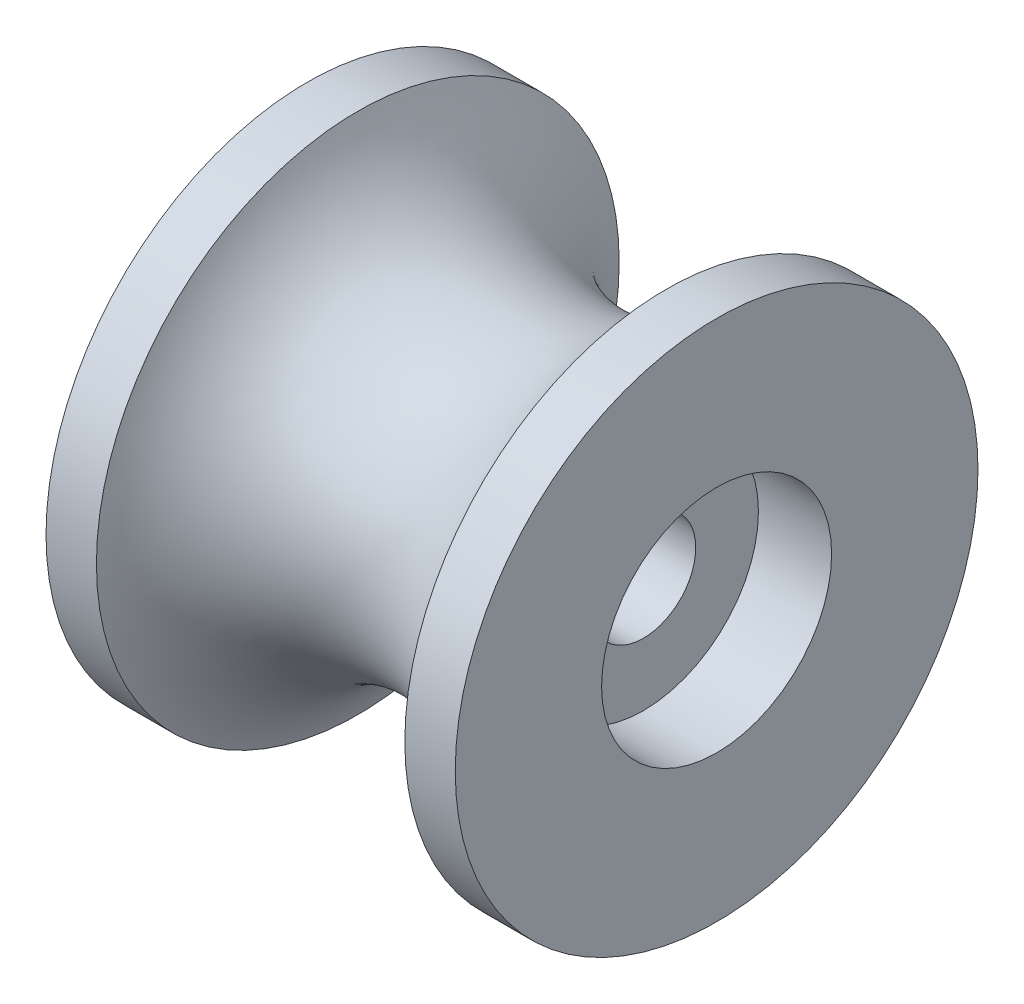
ISO-10303-21;
HEADER;
FILE_DESCRIPTION(('STEP AP214'),'2;1');
FILE_NAME('part.step','',(''),(''),'','','');
FILE_SCHEMA(('AUTOMOTIVE_DESIGN { 1 0 10303 214 1 1 1 1 }'));
ENDSEC;
DATA;
#1=APPLICATION_CONTEXT('core data for automotive mechanical design processes');
#2=APPLICATION_PROTOCOL_DEFINITION('international standard','automotive_design',2000,#1);
#3=PRODUCT_CONTEXT('',#1,'mechanical');
#4=PRODUCT('Part','Part','',(#3));
#5=PRODUCT_RELATED_PRODUCT_CATEGORY('part','',(#4));
#6=PRODUCT_DEFINITION_FORMATION('','',#4);
#7=PRODUCT_DEFINITION_CONTEXT('part definition',#1,'design');
#8=PRODUCT_DEFINITION('design','',#6,#7);
#9=PRODUCT_DEFINITION_SHAPE('','',#8);
#10=(LENGTH_UNIT() NAMED_UNIT(*) SI_UNIT(.MILLI.,.METRE.));
#11=(NAMED_UNIT(*) PLANE_ANGLE_UNIT() SI_UNIT($,.RADIAN.));
#12=(NAMED_UNIT(*) SI_UNIT($,.STERADIAN.) SOLID_ANGLE_UNIT());
#13=UNCERTAINTY_MEASURE_WITH_UNIT(LENGTH_MEASURE(1.E-05),#10,'distance_accuracy_value','');
#14=(GEOMETRIC_REPRESENTATION_CONTEXT(3) GLOBAL_UNCERTAINTY_ASSIGNED_CONTEXT((#13)) GLOBAL_UNIT_ASSIGNED_CONTEXT((#10,
#11,#12)) REPRESENTATION_CONTEXT('',''));
#15=CARTESIAN_POINT('',(0.,0.,0.));
#16=DIRECTION('',(0.,0.,1.));
#17=DIRECTION('',(1.,0.,0.));
#18=AXIS2_PLACEMENT_3D('',#15,#16,#17);
#19=CARTESIAN_POINT('',(-19.57,0.,0.));
#20=DIRECTION('',(1.,0.,0.));
#21=DIRECTION('',(0.,0.,-1.));
#22=AXIS2_PLACEMENT_3D('',#19,#20,#21);
#23=CYLINDRICAL_SURFACE('',#22,25.);
#24=CARTESIAN_POINT('',(-19.57,0.,0.));
#25=DIRECTION('',(1.,0.,0.));
#26=DIRECTION('',(0.,0.,-1.));
#27=AXIS2_PLACEMENT_3D('',#24,#25,#26);
#28=CIRCLE('',#27,25.);
#29=CARTESIAN_POINT('',(-19.57,0.,-25.));
#30=VERTEX_POINT('',#29);
#31=EDGE_CURVE('E10',#30,#30,#28,.T.);
#32=ORIENTED_EDGE('',*,*,#31,.T.);
#33=EDGE_LOOP('',(#32));
#34=FACE_BOUND('',#33,.T.);
#35=CARTESIAN_POINT('',(-14.7478812037526,0.,0.));
#36=DIRECTION('',(1.,0.,0.));
#37=DIRECTION('',(0.,0.,-1.));
#38=AXIS2_PLACEMENT_3D('',#35,#36,#37);
#39=CIRCLE('',#38,25.);
#40=CARTESIAN_POINT('',(-14.7478812037526,0.,-25.));
#41=VERTEX_POINT('',#40);
#42=EDGE_CURVE('E34',#41,#41,#39,.F.);
#43=ORIENTED_EDGE('',*,*,#42,.T.);
#44=EDGE_LOOP('',(#43));
#45=FACE_BOUND('',#44,.T.);
#46=ADVANCED_FACE('F31',(#34,#45),#23,.T.);
#47=CARTESIAN_POINT('',(19.57,0.,0.));
#48=DIRECTION('',(1.,0.,0.));
#49=DIRECTION('',(0.,0.,-1.));
#50=AXIS2_PLACEMENT_3D('',#47,#48,#49);
#51=CIRCLE('',#50,25.);
#52=CARTESIAN_POINT('',(19.57,0.,-25.));
#53=VERTEX_POINT('',#52);
#54=EDGE_CURVE('E38',#53,#53,#51,.T.);
#55=ORIENTED_EDGE('',*,*,#54,.F.);
#56=EDGE_LOOP('',(#55));
#57=FACE_BOUND('',#56,.T.);
#58=CARTESIAN_POINT('',(14.7478812037526,0.,0.));
#59=DIRECTION('',(-1.,0.,0.));
#60=DIRECTION('',(0.,0.,1.));
#61=AXIS2_PLACEMENT_3D('',#58,#59,#60);
#62=CIRCLE('',#61,25.);
#63=CARTESIAN_POINT('',(14.7478812037526,0.,25.));
#64=VERTEX_POINT('',#63);
#65=EDGE_CURVE('E54',#64,#64,#62,.F.);
#66=ORIENTED_EDGE('',*,*,#65,.T.);
#67=EDGE_LOOP('',(#66));
#68=FACE_BOUND('',#67,.T.);
#69=ADVANCED_FACE('F83',(#57,#68),#23,.T.);
#70=CARTESIAN_POINT('',(-19.57,0.,0.));
#71=DIRECTION('',(1.,0.,0.));
#72=DIRECTION('',(0.,0.,-1.));
#73=AXIS2_PLACEMENT_3D('',#70,#71,#72);
#74=CYLINDRICAL_SURFACE('',#73,5.);
#75=CARTESIAN_POINT('',(-12.57,0.,0.));
#76=DIRECTION('',(1.,0.,0.));
#77=DIRECTION('',(0.,0.,-1.));
#78=AXIS2_PLACEMENT_3D('',#75,#76,#77);
#79=CIRCLE('',#78,5.);
#80=CARTESIAN_POINT('',(-12.57,0.,-5.));
#81=VERTEX_POINT('',#80);
#82=EDGE_CURVE('E50',#81,#81,#79,.F.);
#83=ORIENTED_EDGE('',*,*,#82,.T.);
#84=EDGE_LOOP('',(#83));
#85=FACE_BOUND('',#84,.T.);
#86=CARTESIAN_POINT('',(12.57,0.,0.));
#87=DIRECTION('',(1.,0.,0.));
#88=DIRECTION('',(0.,0.,-1.));
#89=AXIS2_PLACEMENT_3D('',#86,#87,#88);
#90=CIRCLE('',#89,5.);
#91=CARTESIAN_POINT('',(12.57,0.,-5.));
#92=VERTEX_POINT('',#91);
#93=EDGE_CURVE('E43',#92,#92,#90,.F.);
#94=ORIENTED_EDGE('',*,*,#93,.F.);
#95=EDGE_LOOP('',(#94));
#96=FACE_BOUND('',#95,.T.);
#97=ADVANCED_FACE('F85',(#85,#96),#74,.F.);
#98=CARTESIAN_POINT('',(-19.57,0.,0.));
#99=DIRECTION('',(1.,0.,0.));
#100=DIRECTION('',(0.,0.,-1.));
#101=AXIS2_PLACEMENT_3D('',#98,#99,#100);
#102=PLANE('',#101);
#103=CARTESIAN_POINT('',(-19.57,0.,0.));
#104=DIRECTION('',(1.,0.,0.));
#105=DIRECTION('',(0.,0.,-1.));
#106=AXIS2_PLACEMENT_3D('',#103,#104,#105);
#107=CIRCLE('',#106,11.);
#108=CARTESIAN_POINT('',(-19.57,0.,-11.));
#109=VERTEX_POINT('',#108);
#110=EDGE_CURVE('E59',#109,#109,#107,.T.);
#111=ORIENTED_EDGE('',*,*,#110,.T.);
#112=EDGE_LOOP('',(#111));
#113=FACE_BOUND('',#112,.T.);
#114=ORIENTED_EDGE('',*,*,#31,.F.);
#115=EDGE_LOOP('',(#114));
#116=FACE_BOUND('',#115,.T.);
#117=ADVANCED_FACE('F79',(#113,#116),#102,.F.);
#118=CARTESIAN_POINT('',(19.57,0.,0.));
#119=DIRECTION('',(1.,0.,0.));
#120=DIRECTION('',(0.,0.,-1.));
#121=AXIS2_PLACEMENT_3D('',#118,#119,#120);
#122=PLANE('',#121);
#123=CARTESIAN_POINT('',(19.57,0.,0.));
#124=DIRECTION('',(1.,0.,0.));
#125=DIRECTION('',(0.,0.,-1.));
#126=AXIS2_PLACEMENT_3D('',#123,#124,#125);
#127=CIRCLE('',#126,11.);
#128=CARTESIAN_POINT('',(19.57,0.,-11.));
#129=VERTEX_POINT('',#128);
#130=EDGE_CURVE('E52',#129,#129,#127,.T.);
#131=ORIENTED_EDGE('',*,*,#130,.F.);
#132=EDGE_LOOP('',(#131));
#133=FACE_BOUND('',#132,.T.);
#134=ORIENTED_EDGE('',*,*,#54,.T.);
#135=EDGE_LOOP('',(#134));
#136=FACE_BOUND('',#135,.T.);
#137=ADVANCED_FACE('F75',(#133,#136),#122,.T.);
#138=CARTESIAN_POINT('',(12.57,0.,0.));
#139=DIRECTION('',(1.,0.,0.));
#140=DIRECTION('',(0.,0.,-1.));
#141=AXIS2_PLACEMENT_3D('',#138,#139,#140);
#142=PLANE('',#141);
#143=CARTESIAN_POINT('',(12.57,0.,0.));
#144=DIRECTION('',(1.,0.,0.));
#145=DIRECTION('',(0.,0.,-1.));
#146=AXIS2_PLACEMENT_3D('',#143,#144,#145);
#147=CIRCLE('',#146,11.);
#148=CARTESIAN_POINT('',(12.57,0.,-11.));
#149=VERTEX_POINT('',#148);
#150=EDGE_CURVE('E49',#149,#149,#147,.T.);
#151=ORIENTED_EDGE('',*,*,#150,.T.);
#152=EDGE_LOOP('',(#151));
#153=FACE_BOUND('',#152,.T.);
#154=ORIENTED_EDGE('',*,*,#93,.T.);
#155=EDGE_LOOP('',(#154));
#156=FACE_BOUND('',#155,.T.);
#157=ADVANCED_FACE('F78',(#153,#156),#142,.T.);
#158=CARTESIAN_POINT('',(12.57,0.,0.));
#159=DIRECTION('',(1.,0.,0.));
#160=DIRECTION('',(0.,0.,-1.));
#161=AXIS2_PLACEMENT_3D('',#158,#159,#160);
#162=CYLINDRICAL_SURFACE('',#161,11.);
#163=ORIENTED_EDGE('',*,*,#150,.F.);
#164=EDGE_LOOP('',(#163));
#165=FACE_BOUND('',#164,.T.);
#166=ORIENTED_EDGE('',*,*,#130,.T.);
#167=EDGE_LOOP('',(#166));
#168=FACE_BOUND('',#167,.T.);
#169=ADVANCED_FACE('F73',(#165,#168),#162,.F.);
#170=CARTESIAN_POINT('',(-12.57,0.,0.));
#171=DIRECTION('',(1.,0.,0.));
#172=DIRECTION('',(0.,0.,-1.));
#173=AXIS2_PLACEMENT_3D('',#170,#171,#172);
#174=PLANE('',#173);
#175=CARTESIAN_POINT('',(-12.57,0.,0.));
#176=DIRECTION('',(1.,0.,0.));
#177=DIRECTION('',(0.,0.,-1.));
#178=AXIS2_PLACEMENT_3D('',#175,#176,#177);
#179=CIRCLE('',#178,11.);
#180=CARTESIAN_POINT('',(-12.57,0.,-11.));
#181=VERTEX_POINT('',#180);
#182=EDGE_CURVE('E53',#181,#181,#179,.T.);
#183=ORIENTED_EDGE('',*,*,#182,.F.);
#184=EDGE_LOOP('',(#183));
#185=FACE_BOUND('',#184,.T.);
#186=ORIENTED_EDGE('',*,*,#82,.F.);
#187=EDGE_LOOP('',(#186));
#188=FACE_BOUND('',#187,.T.);
#189=ADVANCED_FACE('F120',(#185,#188),#174,.F.);
#190=CARTESIAN_POINT('',(-12.57,0.,0.));
#191=DIRECTION('',(-1.,0.,0.));
#192=DIRECTION('',(0.,0.,1.));
#193=AXIS2_PLACEMENT_3D('',#190,#191,#192);
#194=CYLINDRICAL_SURFACE('',#193,11.);
#195=ORIENTED_EDGE('',*,*,#182,.T.);
#196=EDGE_LOOP('',(#195));
#197=FACE_BOUND('',#196,.T.);
#198=ORIENTED_EDGE('',*,*,#110,.F.);
#199=EDGE_LOOP('',(#198));
#200=FACE_BOUND('',#199,.T.);
#201=ADVANCED_FACE('F101',(#197,#200),#194,.F.);
#202=CARTESIAN_POINT('',(0.,0.,0.));
#203=DIRECTION('',(-1.,0.,0.));
#204=DIRECTION('',(0.,0.,1.));
#205=AXIS2_PLACEMENT_3D('',#202,#203,#204);
#206=TOROIDAL_SURFACE('',#205,30.875,15.875);
#207=ORIENTED_EDGE('',*,*,#42,.F.);
#208=EDGE_LOOP('',(#207));
#209=FACE_BOUND('',#208,.T.);
#210=ORIENTED_EDGE('',*,*,#65,.F.);
#211=EDGE_LOOP('',(#210));
#212=FACE_BOUND('',#211,.T.);
#213=ADVANCED_FACE('F110',(#209,#212),#206,.F.);
#214=CLOSED_SHELL('',(#46,#69,#97,#117,#137,#157,#169,#189,#201,#213));
#215=MANIFOLD_SOLID_BREP('B2',#214);
#216=ADVANCED_BREP_SHAPE_REPRESENTATION('',(#18,#215),#14);
#217=SHAPE_DEFINITION_REPRESENTATION(#9,#216);
ENDSEC;
END-ISO-10303-21;
